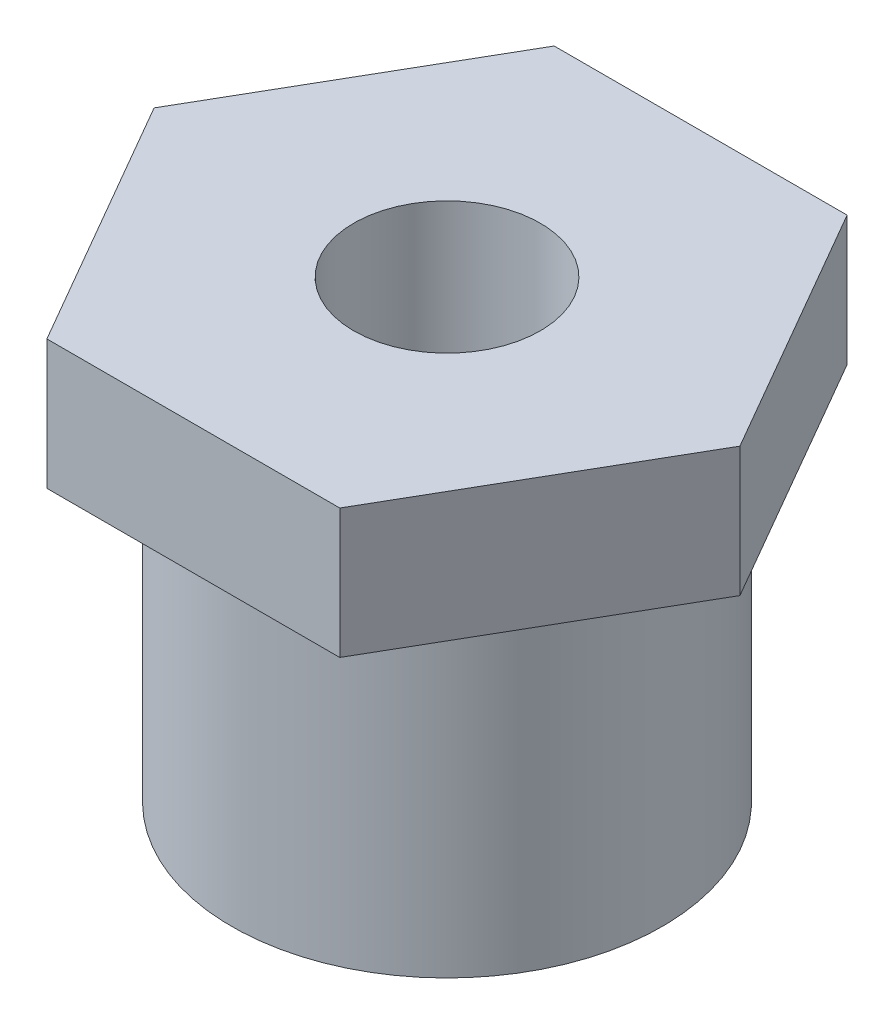
ISO-10303-21;
HEADER;
FILE_DESCRIPTION(('STEP AP214'),'2;1');
FILE_NAME('part.step','',(''),(''),'','','');
FILE_SCHEMA(('AUTOMOTIVE_DESIGN { 1 0 10303 214 1 1 1 1 }'));
ENDSEC;
DATA;
#1=APPLICATION_CONTEXT('core data for automotive mechanical design processes');
#2=APPLICATION_PROTOCOL_DEFINITION('international standard','automotive_design',2000,#1);
#3=PRODUCT_CONTEXT('',#1,'mechanical');
#4=PRODUCT('Part','Part','',(#3));
#5=PRODUCT_RELATED_PRODUCT_CATEGORY('part','',(#4));
#6=PRODUCT_DEFINITION_FORMATION('','',#4);
#7=PRODUCT_DEFINITION_CONTEXT('part definition',#1,'design');
#8=PRODUCT_DEFINITION('design','',#6,#7);
#9=PRODUCT_DEFINITION_SHAPE('','',#8);
#10=(LENGTH_UNIT() NAMED_UNIT(*) SI_UNIT(.MILLI.,.METRE.));
#11=(NAMED_UNIT(*) PLANE_ANGLE_UNIT() SI_UNIT($,.RADIAN.));
#12=(NAMED_UNIT(*) SI_UNIT($,.STERADIAN.) SOLID_ANGLE_UNIT());
#13=UNCERTAINTY_MEASURE_WITH_UNIT(LENGTH_MEASURE(1.E-05),#10,'distance_accuracy_value','');
#14=(GEOMETRIC_REPRESENTATION_CONTEXT(3) GLOBAL_UNCERTAINTY_ASSIGNED_CONTEXT((#13)) GLOBAL_UNIT_ASSIGNED_CONTEXT((#10,
#11,#12)) REPRESENTATION_CONTEXT('',''));
#15=CARTESIAN_POINT('',(0.,0.,0.));
#16=DIRECTION('',(0.,0.,1.));
#17=DIRECTION('',(1.,0.,0.));
#18=AXIS2_PLACEMENT_3D('',#15,#16,#17);
#19=CARTESIAN_POINT('',(9.11044291024501,8.0518,15.77975));
#20=DIRECTION('',(-0.866025403784438,0.,-0.5));
#21=DIRECTION('',(-0.5,0.,0.866025403784439));
#22=AXIS2_PLACEMENT_3D('',#19,#20,#21);
#23=PLANE('',#22);
#24=DIRECTION('',(0.5,0.,-0.866025403784438));
#25=VECTOR('',#24,1.);
#26=CARTESIAN_POINT('',(9.11044291024501,0.,15.77975));
#27=LINE('',#26,#25);
#28=CARTESIAN_POINT('',(9.11044291024501,0.,15.77975));
#29=VERTEX_POINT('',#28);
#30=CARTESIAN_POINT('',(18.22088582049,0.,0.));
#31=VERTEX_POINT('',#30);
#32=EDGE_CURVE('E124',#29,#31,#27,.T.);
#33=ORIENTED_EDGE('',*,*,#32,.T.);
#34=DIRECTION('',(0.,-1.,0.));
#35=VECTOR('',#34,1.);
#36=CARTESIAN_POINT('',(18.22088582049,8.0518,0.));
#37=LINE('',#36,#35);
#38=CARTESIAN_POINT('',(18.22088582049,8.0518,0.));
#39=VERTEX_POINT('',#38);
#40=EDGE_CURVE('E41',#39,#31,#37,.T.);
#41=ORIENTED_EDGE('',*,*,#40,.F.);
#42=DIRECTION('',(0.5,0.,-0.866025403784438));
#43=VECTOR('',#42,1.);
#44=CARTESIAN_POINT('',(9.11044291024501,8.0518,15.77975));
#45=LINE('',#44,#43);
#46=CARTESIAN_POINT('',(9.11044291024501,8.0518,15.77975));
#47=VERTEX_POINT('',#46);
#48=EDGE_CURVE('E135',#47,#39,#45,.T.);
#49=ORIENTED_EDGE('',*,*,#48,.F.);
#50=DIRECTION('',(0.,-1.,0.));
#51=VECTOR('',#50,1.);
#52=CARTESIAN_POINT('',(9.11044291024501,8.0518,15.77975));
#53=LINE('',#52,#51);
#54=EDGE_CURVE('E120',#47,#29,#53,.T.);
#55=ORIENTED_EDGE('',*,*,#54,.T.);
#56=EDGE_LOOP('',(#33,#41,#49,#55));
#57=FACE_BOUND('',#56,.T.);
#58=ADVANCED_FACE('F38',(#57),#23,.F.);
#59=CARTESIAN_POINT('',(18.22088582049,8.0518,0.));
#60=DIRECTION('',(-0.866025403784431,0.,0.500000000000012));
#61=DIRECTION('',(0.500000000000013,0.,0.866025403784432));
#62=AXIS2_PLACEMENT_3D('',#59,#60,#61);
#63=PLANE('',#62);
#64=DIRECTION('',(-0.500000000000012,0.,-0.866025403784431));
#65=VECTOR('',#64,1.);
#66=CARTESIAN_POINT('',(18.22088582049,0.,0.));
#67=LINE('',#66,#65);
#68=CARTESIAN_POINT('',(9.11044291024471,0.,-15.77975));
#69=VERTEX_POINT('',#68);
#70=EDGE_CURVE('E127',#31,#69,#67,.T.);
#71=ORIENTED_EDGE('',*,*,#70,.T.);
#72=DIRECTION('',(0.,-1.,0.));
#73=VECTOR('',#72,1.);
#74=CARTESIAN_POINT('',(9.11044291024471,8.0518,-15.77975));
#75=LINE('',#74,#73);
#76=CARTESIAN_POINT('',(9.11044291024471,8.0518,-15.77975));
#77=VERTEX_POINT('',#76);
#78=EDGE_CURVE('E138',#77,#69,#75,.T.);
#79=ORIENTED_EDGE('',*,*,#78,.F.);
#80=DIRECTION('',(-0.500000000000012,0.,-0.866025403784431));
#81=VECTOR('',#80,1.);
#82=CARTESIAN_POINT('',(18.22088582049,8.0518,0.));
#83=LINE('',#82,#81);
#84=EDGE_CURVE('E93',#39,#77,#83,.T.);
#85=ORIENTED_EDGE('',*,*,#84,.F.);
#86=ORIENTED_EDGE('',*,*,#40,.T.);
#87=EDGE_LOOP('',(#71,#79,#85,#86));
#88=FACE_BOUND('',#87,.T.);
#89=ADVANCED_FACE('F143',(#88),#63,.F.);
#90=CARTESIAN_POINT('',(9.11044291024471,8.0518,-15.77975));
#91=DIRECTION('',(0.,0.,1.));
#92=DIRECTION('',(1.,0.,0.));
#93=AXIS2_PLACEMENT_3D('',#90,#91,#92);
#94=PLANE('',#93);
#95=DIRECTION('',(-1.,0.,0.));
#96=VECTOR('',#95,1.);
#97=CARTESIAN_POINT('',(9.11044291024471,0.,-15.77975));
#98=LINE('',#97,#96);
#99=CARTESIAN_POINT('',(-9.11044291024493,0.,-15.77975));
#100=VERTEX_POINT('',#99);
#101=EDGE_CURVE('E130',#69,#100,#98,.T.);
#102=ORIENTED_EDGE('',*,*,#101,.T.);
#103=DIRECTION('',(0.,-1.,0.));
#104=VECTOR('',#103,1.);
#105=CARTESIAN_POINT('',(-9.11044291024493,8.0518,-15.77975));
#106=LINE('',#105,#104);
#107=CARTESIAN_POINT('',(-9.11044291024493,8.0518,-15.77975));
#108=VERTEX_POINT('',#107);
#109=EDGE_CURVE('E115',#108,#100,#106,.T.);
#110=ORIENTED_EDGE('',*,*,#109,.F.);
#111=DIRECTION('',(-1.,0.,0.));
#112=VECTOR('',#111,1.);
#113=CARTESIAN_POINT('',(9.11044291024471,8.0518,-15.77975));
#114=LINE('',#113,#112);
#115=EDGE_CURVE('E106',#77,#108,#114,.T.);
#116=ORIENTED_EDGE('',*,*,#115,.F.);
#117=ORIENTED_EDGE('',*,*,#78,.T.);
#118=EDGE_LOOP('',(#102,#110,#116,#117));
#119=FACE_BOUND('',#118,.T.);
#120=ADVANCED_FACE('F149',(#119),#94,.F.);
#121=CARTESIAN_POINT('',(-9.11044291024493,8.0518,-15.77975));
#122=DIRECTION('',(0.866025403784438,0.,0.500000000000001));
#123=DIRECTION('',(0.500000000000001,0.,-0.866025403784438));
#124=AXIS2_PLACEMENT_3D('',#121,#122,#123);
#125=PLANE('',#124);
#126=DIRECTION('',(-0.500000000000001,0.,0.866025403784438));
#127=VECTOR('',#126,1.);
#128=CARTESIAN_POINT('',(-9.11044291024493,0.,-15.77975));
#129=LINE('',#128,#127);
#130=CARTESIAN_POINT('',(-18.22088582049,0.,0.));
#131=VERTEX_POINT('',#130);
#132=EDGE_CURVE('E114',#100,#131,#129,.T.);
#133=ORIENTED_EDGE('',*,*,#132,.T.);
#134=DIRECTION('',(0.,-1.,0.));
#135=VECTOR('',#134,1.);
#136=CARTESIAN_POINT('',(-18.22088582049,8.0518,0.));
#137=LINE('',#136,#135);
#138=CARTESIAN_POINT('',(-18.22088582049,8.0518,0.));
#139=VERTEX_POINT('',#138);
#140=EDGE_CURVE('E111',#139,#131,#137,.T.);
#141=ORIENTED_EDGE('',*,*,#140,.F.);
#142=DIRECTION('',(-0.500000000000001,0.,0.866025403784438));
#143=VECTOR('',#142,1.);
#144=CARTESIAN_POINT('',(-9.11044291024493,8.0518,-15.77975));
#145=LINE('',#144,#143);
#146=EDGE_CURVE('E100',#108,#139,#145,.T.);
#147=ORIENTED_EDGE('',*,*,#146,.F.);
#148=ORIENTED_EDGE('',*,*,#109,.T.);
#149=EDGE_LOOP('',(#133,#141,#147,#148));
#150=FACE_BOUND('',#149,.T.);
#151=ADVANCED_FACE('F112',(#150),#125,.F.);
#152=CARTESIAN_POINT('',(-18.22088582049,8.0518,0.));
#153=DIRECTION('',(0.866025403784437,0.,-0.500000000000002));
#154=DIRECTION('',(-0.500000000000002,0.,-0.866025403784438));
#155=AXIS2_PLACEMENT_3D('',#152,#153,#154);
#156=PLANE('',#155);
#157=DIRECTION('',(0.500000000000002,0.,0.866025403784437));
#158=VECTOR('',#157,1.);
#159=CARTESIAN_POINT('',(-18.22088582049,0.,0.));
#160=LINE('',#159,#158);
#161=CARTESIAN_POINT('',(-9.11044291024504,0.,15.7797499999999));
#162=VERTEX_POINT('',#161);
#163=EDGE_CURVE('E78',#131,#162,#160,.T.);
#164=ORIENTED_EDGE('',*,*,#163,.T.);
#165=DIRECTION('',(0.,-1.,0.));
#166=VECTOR('',#165,1.);
#167=CARTESIAN_POINT('',(-9.11044291024504,8.0518,15.7797499999999));
#168=LINE('',#167,#166);
#169=CARTESIAN_POINT('',(-9.11044291024504,8.0518,15.7797499999999));
#170=VERTEX_POINT('',#169);
#171=EDGE_CURVE('E116',#170,#162,#168,.T.);
#172=ORIENTED_EDGE('',*,*,#171,.F.);
#173=DIRECTION('',(0.500000000000002,0.,0.866025403784437));
#174=VECTOR('',#173,1.);
#175=CARTESIAN_POINT('',(-18.22088582049,8.0518,0.));
#176=LINE('',#175,#174);
#177=EDGE_CURVE('E104',#139,#170,#176,.T.);
#178=ORIENTED_EDGE('',*,*,#177,.F.);
#179=ORIENTED_EDGE('',*,*,#140,.T.);
#180=EDGE_LOOP('',(#164,#172,#178,#179));
#181=FACE_BOUND('',#180,.T.);
#182=ADVANCED_FACE('F118',(#181),#156,.F.);
#183=CARTESIAN_POINT('',(-9.11044291024504,8.0518,15.7797499999999));
#184=DIRECTION('',(0.,0.,-1.));
#185=DIRECTION('',(-1.,0.,0.));
#186=AXIS2_PLACEMENT_3D('',#183,#184,#185);
#187=PLANE('',#186);
#188=DIRECTION('',(1.,0.,0.));
#189=VECTOR('',#188,1.);
#190=CARTESIAN_POINT('',(-9.11044291024504,0.,15.7797499999999));
#191=LINE('',#190,#189);
#192=EDGE_CURVE('E84',#162,#29,#191,.T.);
#193=ORIENTED_EDGE('',*,*,#192,.T.);
#194=ORIENTED_EDGE('',*,*,#54,.F.);
#195=DIRECTION('',(1.,0.,0.));
#196=VECTOR('',#195,1.);
#197=CARTESIAN_POINT('',(-9.11044291024504,8.0518,15.7797499999999));
#198=LINE('',#197,#196);
#199=EDGE_CURVE('E55',#170,#47,#198,.T.);
#200=ORIENTED_EDGE('',*,*,#199,.F.);
#201=ORIENTED_EDGE('',*,*,#171,.T.);
#202=EDGE_LOOP('',(#193,#194,#200,#201));
#203=FACE_BOUND('',#202,.T.);
#204=ADVANCED_FACE('F179',(#203),#187,.F.);
#205=CARTESIAN_POINT('',(0.,8.0518,0.));
#206=DIRECTION('',(0.,1.,0.));
#207=DIRECTION('',(0.,0.,1.));
#208=AXIS2_PLACEMENT_3D('',#205,#206,#207);
#209=PLANE('',#208);
#210=CARTESIAN_POINT('',(0.,8.0518,0.));
#211=DIRECTION('',(0.,1.,0.));
#212=DIRECTION('',(0.,0.,1.));
#213=AXIS2_PLACEMENT_3D('',#210,#211,#212);
#214=CIRCLE('',#213,5.8039);
#215=CARTESIAN_POINT('',(0.,8.0518,5.8039));
#216=VERTEX_POINT('',#215);
#217=EDGE_CURVE('E155',#216,#216,#214,.T.);
#218=ORIENTED_EDGE('',*,*,#217,.F.);
#219=EDGE_LOOP('',(#218));
#220=FACE_BOUND('',#219,.T.);
#221=ORIENTED_EDGE('',*,*,#48,.T.);
#222=ORIENTED_EDGE('',*,*,#84,.T.);
#223=ORIENTED_EDGE('',*,*,#115,.T.);
#224=ORIENTED_EDGE('',*,*,#146,.T.);
#225=ORIENTED_EDGE('',*,*,#177,.T.);
#226=ORIENTED_EDGE('',*,*,#199,.T.);
#227=EDGE_LOOP('',(#221,#222,#223,#224,#225,#226));
#228=FACE_BOUND('',#227,.T.);
#229=ADVANCED_FACE('F102',(#220,#228),#209,.T.);
#230=CARTESIAN_POINT('',(0.,0.,0.));
#231=DIRECTION('',(0.,1.,0.));
#232=DIRECTION('',(0.,0.,1.));
#233=AXIS2_PLACEMENT_3D('',#230,#231,#232);
#234=PLANE('',#233);
#235=CARTESIAN_POINT('',(0.,0.,0.));
#236=DIRECTION('',(0.,-1.,0.));
#237=DIRECTION('',(0.,0.,-1.));
#238=AXIS2_PLACEMENT_3D('',#235,#236,#237);
#239=CIRCLE('',#238,13.39215);
#240=CARTESIAN_POINT('',(0.,0.,-13.39215));
#241=VERTEX_POINT('',#240);
#242=EDGE_CURVE('E11',#241,#241,#239,.T.);
#243=ORIENTED_EDGE('',*,*,#242,.F.);
#244=EDGE_LOOP('',(#243));
#245=FACE_BOUND('',#244,.T.);
#246=ORIENTED_EDGE('',*,*,#32,.F.);
#247=ORIENTED_EDGE('',*,*,#192,.F.);
#248=ORIENTED_EDGE('',*,*,#163,.F.);
#249=ORIENTED_EDGE('',*,*,#132,.F.);
#250=ORIENTED_EDGE('',*,*,#101,.F.);
#251=ORIENTED_EDGE('',*,*,#70,.F.);
#252=EDGE_LOOP('',(#246,#247,#248,#249,#250,#251));
#253=FACE_BOUND('',#252,.T.);
#254=ADVANCED_FACE('F148',(#245,#253),#234,.F.);
#255=CARTESIAN_POINT('',(0.,-20.2438,0.));
#256=DIRECTION('',(0.,1.,0.));
#257=DIRECTION('',(0.,0.,1.));
#258=AXIS2_PLACEMENT_3D('',#255,#256,#257);
#259=CYLINDRICAL_SURFACE('',#258,13.39215);
#260=CARTESIAN_POINT('',(0.,-20.2438,0.));
#261=DIRECTION('',(0.,-1.,0.));
#262=DIRECTION('',(0.,0.,-1.));
#263=AXIS2_PLACEMENT_3D('',#260,#261,#262);
#264=CIRCLE('',#263,13.39215);
#265=CARTESIAN_POINT('',(0.,-20.2438,-13.39215));
#266=VERTEX_POINT('',#265);
#267=EDGE_CURVE('E128',#266,#266,#264,.T.);
#268=ORIENTED_EDGE('',*,*,#267,.F.);
#269=EDGE_LOOP('',(#268));
#270=FACE_BOUND('',#269,.T.);
#271=ORIENTED_EDGE('',*,*,#242,.T.);
#272=EDGE_LOOP('',(#271));
#273=FACE_BOUND('',#272,.T.);
#274=ADVANCED_FACE('F185',(#270,#273),#259,.T.);
#275=CARTESIAN_POINT('',(0.,-20.2438,0.));
#276=DIRECTION('',(0.,-1.,0.));
#277=DIRECTION('',(0.,0.,-1.));
#278=AXIS2_PLACEMENT_3D('',#275,#276,#277);
#279=PLANE('',#278);
#280=CARTESIAN_POINT('',(0.,-20.2438,0.));
#281=DIRECTION('',(0.,-1.,0.));
#282=DIRECTION('',(0.,0.,-1.));
#283=AXIS2_PLACEMENT_3D('',#280,#281,#282);
#284=CIRCLE('',#283,8.0137);
#285=CARTESIAN_POINT('',(0.,-20.2438,-8.0137));
#286=VERTEX_POINT('',#285);
#287=EDGE_CURVE('E158',#286,#286,#284,.T.);
#288=ORIENTED_EDGE('',*,*,#287,.F.);
#289=EDGE_LOOP('',(#288));
#290=FACE_BOUND('',#289,.T.);
#291=ORIENTED_EDGE('',*,*,#267,.T.);
#292=EDGE_LOOP('',(#291));
#293=FACE_BOUND('',#292,.T.);
#294=ADVANCED_FACE('F174',(#290,#293),#279,.T.);
#295=CARTESIAN_POINT('',(0.,-2.3368,0.));
#296=DIRECTION('',(0.,1.,0.));
#297=DIRECTION('',(0.,0.,1.));
#298=AXIS2_PLACEMENT_3D('',#295,#296,#297);
#299=CYLINDRICAL_SURFACE('',#298,5.8039);
#300=CARTESIAN_POINT('',(0.,-2.3368,0.));
#301=DIRECTION('',(0.,1.,0.));
#302=DIRECTION('',(0.,0.,1.));
#303=AXIS2_PLACEMENT_3D('',#300,#301,#302);
#304=CIRCLE('',#303,5.8039);
#305=CARTESIAN_POINT('',(0.,-2.3368,5.8039));
#306=VERTEX_POINT('',#305);
#307=EDGE_CURVE('E164',#306,#306,#304,.T.);
#308=CARTESIAN_POINT('',(0.,-2.3368,5.8039));
#309=CARTESIAN_POINT('',(0.,-2.22858541666667,5.8039));
#310=CARTESIAN_POINT('',(0.,-2.12037083333333,5.8039));
#311=CARTESIAN_POINT('',(0.,-1.90394166666667,5.8039));
#312=CARTESIAN_POINT('',(0.,-1.79572708333333,5.8039));
#313=CARTESIAN_POINT('',(0.,-1.57929791666667,5.8039));
#314=CARTESIAN_POINT('',(0.,-1.47108333333333,5.8039));
#315=CARTESIAN_POINT('',(0.,-1.25465416666667,5.8039));
#316=CARTESIAN_POINT('',(0.,-1.14643958333333,5.8039));
#317=CARTESIAN_POINT('',(0.,-0.930010416666667,5.8039));
#318=CARTESIAN_POINT('',(0.,-0.821795833333334,5.8039));
#319=CARTESIAN_POINT('',(0.,-0.605366666666667,5.8039));
#320=CARTESIAN_POINT('',(0.,-0.497152083333334,5.8039));
#321=CARTESIAN_POINT('',(0.,-0.280722916666667,5.8039));
#322=CARTESIAN_POINT('',(0.,-0.172508333333334,5.8039));
#323=CARTESIAN_POINT('',(0.,0.0439208333333329,5.8039));
#324=CARTESIAN_POINT('',(0.,0.152135416666666,5.8039));
#325=CARTESIAN_POINT('',(0.,0.368564583333333,5.8039));
#326=CARTESIAN_POINT('',(0.,0.476779166666666,5.8039));
#327=CARTESIAN_POINT('',(0.,0.693208333333333,5.8039));
#328=CARTESIAN_POINT('',(0.,0.801422916666666,5.8039));
#329=CARTESIAN_POINT('',(0.,1.01785208333333,5.8039));
#330=CARTESIAN_POINT('',(0.,1.12606666666667,5.8039));
#331=CARTESIAN_POINT('',(0.,1.34249583333333,5.8039));
#332=CARTESIAN_POINT('',(0.,1.45071041666667,5.8039));
#333=CARTESIAN_POINT('',(0.,1.66713958333333,5.8039));
#334=CARTESIAN_POINT('',(0.,1.77535416666667,5.8039));
#335=CARTESIAN_POINT('',(0.,1.99178333333333,5.8039));
#336=CARTESIAN_POINT('',(0.,2.09999791666667,5.8039));
#337=CARTESIAN_POINT('',(0.,2.31642708333333,5.8039));
#338=CARTESIAN_POINT('',(0.,2.42464166666667,5.8039));
#339=CARTESIAN_POINT('',(0.,2.64107083333333,5.8039));
#340=CARTESIAN_POINT('',(0.,2.74928541666667,5.8039));
#341=CARTESIAN_POINT('',(0.,2.96571458333333,5.8039));
#342=CARTESIAN_POINT('',(0.,3.07392916666667,5.8039));
#343=CARTESIAN_POINT('',(0.,3.29035833333333,5.8039));
#344=CARTESIAN_POINT('',(0.,3.39857291666667,5.8039));
#345=CARTESIAN_POINT('',(0.,3.61500208333333,5.8039));
#346=CARTESIAN_POINT('',(0.,3.72321666666667,5.8039));
#347=CARTESIAN_POINT('',(0.,3.93964583333333,5.8039));
#348=CARTESIAN_POINT('',(0.,4.04786041666667,5.8039));
#349=CARTESIAN_POINT('',(0.,4.26428958333333,5.8039));
#350=CARTESIAN_POINT('',(0.,4.37250416666667,5.8039));
#351=CARTESIAN_POINT('',(0.,4.58893333333333,5.8039));
#352=CARTESIAN_POINT('',(0.,4.69714791666667,5.8039));
#353=CARTESIAN_POINT('',(0.,4.91357708333333,5.8039));
#354=CARTESIAN_POINT('',(0.,5.02179166666667,5.8039));
#355=CARTESIAN_POINT('',(0.,5.23822083333333,5.8039));
#356=CARTESIAN_POINT('',(0.,5.34643541666667,5.8039));
#357=CARTESIAN_POINT('',(0.,5.56286458333333,5.8039));
#358=CARTESIAN_POINT('',(0.,5.67107916666667,5.8039));
#359=CARTESIAN_POINT('',(0.,5.88750833333333,5.8039));
#360=CARTESIAN_POINT('',(0.,5.99572291666667,5.8039));
#361=CARTESIAN_POINT('',(0.,6.21215208333333,5.8039));
#362=CARTESIAN_POINT('',(0.,6.32036666666667,5.8039));
#363=CARTESIAN_POINT('',(0.,6.53679583333333,5.8039));
#364=CARTESIAN_POINT('',(0.,6.64501041666667,5.8039));
#365=CARTESIAN_POINT('',(0.,6.86143958333333,5.8039));
#366=CARTESIAN_POINT('',(0.,6.96965416666667,5.8039));
#367=CARTESIAN_POINT('',(0.,7.18608333333333,5.8039));
#368=CARTESIAN_POINT('',(0.,7.29429791666667,5.8039));
#369=CARTESIAN_POINT('',(0.,7.51072708333333,5.8039));
#370=CARTESIAN_POINT('',(0.,7.61894166666667,5.8039));
#371=CARTESIAN_POINT('',(0.,7.83537083333333,5.8039));
#372=CARTESIAN_POINT('',(0.,7.94358541666667,5.8039));
#373=CARTESIAN_POINT('',(0.,8.0518,5.8039));
#374=B_SPLINE_CURVE_WITH_KNOTS('',3,(#308,#309,#310,#311,#312,#313,#314,#315,#316,#317,#318,
#319,#320,#321,#322,#323,#324,#325,#326,#327,#328,#329,#330,#331,#332,#333,#334,#335,#336,#337,
#338,#339,#340,#341,#342,#343,#344,#345,#346,#347,#348,#349,#350,#351,#352,#353,#354,#355,#356,
#357,#358,#359,#360,#361,#362,#363,#364,#365,#366,#367,#368,#369,#370,#371,#372,#373),
.UNSPECIFIED.,.F.,.F.,(4,2,2,2,2,2,2,2,2,2,2,2,2,2,2,2,2,2,2,2,2,2,2,2,2,2,2,2,2,2,2,2,4),(0.,
0.32464375,0.6492875,0.97393125,1.298575,1.62321875,1.9478625,2.27250625,2.59715,2.92179375,
3.2464375,3.57108125,3.895725,4.22036875,4.5450125,4.86965625,5.1943,5.51894375,5.8435875,
6.16823125,6.492875,6.81751875,7.1421625,7.46680625,7.79145,8.11609375,8.4407375,8.76538125,
9.090025,9.41466875,9.7393125,10.06395625,10.3886),.UNSPECIFIED.);
#375=EDGE_CURVE('BSEAM170',#306,#216,#374,.T.);
#376=ORIENTED_EDGE('',*,*,#307,.F.);
#377=ORIENTED_EDGE('',*,*,#217,.T.);
#378=ORIENTED_EDGE('',*,*,#375,.T.);
#379=ORIENTED_EDGE('',*,*,#375,.F.);
#380=EDGE_LOOP('',(#376,#378,#377,#379));
#381=FACE_BOUND('',#380,.T.);
#382=ADVANCED_FACE('F170',(#381),#299,.F.);
#383=CARTESIAN_POINT('',(0.,-4.0513,0.));
#384=DIRECTION('',(0.,-1.,0.));
#385=DIRECTION('',(0.,0.,-1.));
#386=AXIS2_PLACEMENT_3D('',#383,#384,#385);
#387=CYLINDRICAL_SURFACE('',#386,8.0137);
#388=CARTESIAN_POINT('',(0.,-4.0513,0.));
#389=DIRECTION('',(0.,1.,0.));
#390=DIRECTION('',(0.,0.,1.));
#391=AXIS2_PLACEMENT_3D('',#388,#389,#390);
#392=CIRCLE('',#391,8.0137);
#393=CARTESIAN_POINT('',(0.,-4.0513,8.0137));
#394=VERTEX_POINT('',#393);
#395=EDGE_CURVE('E161',#394,#394,#392,.T.);
#396=ORIENTED_EDGE('',*,*,#395,.T.);
#397=EDGE_LOOP('',(#396));
#398=FACE_BOUND('',#397,.T.);
#399=ORIENTED_EDGE('',*,*,#287,.T.);
#400=EDGE_LOOP('',(#399));
#401=FACE_BOUND('',#400,.T.);
#402=ADVANCED_FACE('F173',(#398,#401),#387,.F.);
#403=CARTESIAN_POINT('',(0.,-2.3368,0.));
#404=DIRECTION('',(0.,-1.,0.));
#405=DIRECTION('',(0.,0.,-1.));
#406=AXIS2_PLACEMENT_3D('',#403,#404,#405);
#407=CONICAL_SURFACE('',#406,5.8039,0.910947900505974);
#408=ORIENTED_EDGE('',*,*,#395,.F.);
#409=EDGE_LOOP('',(#408));
#410=FACE_BOUND('',#409,.T.);
#411=ORIENTED_EDGE('',*,*,#307,.T.);
#412=EDGE_LOOP('',(#411));
#413=FACE_BOUND('',#412,.T.);
#414=ADVANCED_FACE('F168',(#410,#413),#407,.F.);
#415=CLOSED_SHELL('',(#58,#89,#120,#151,#182,#204,#229,#254,#274,#294,#382,#402,#414));
#416=MANIFOLD_SOLID_BREP('B2',#415);
#417=ADVANCED_BREP_SHAPE_REPRESENTATION('',(#18,#416),#14);
#418=SHAPE_DEFINITION_REPRESENTATION(#9,#417);
ENDSEC;
END-ISO-10303-21;
